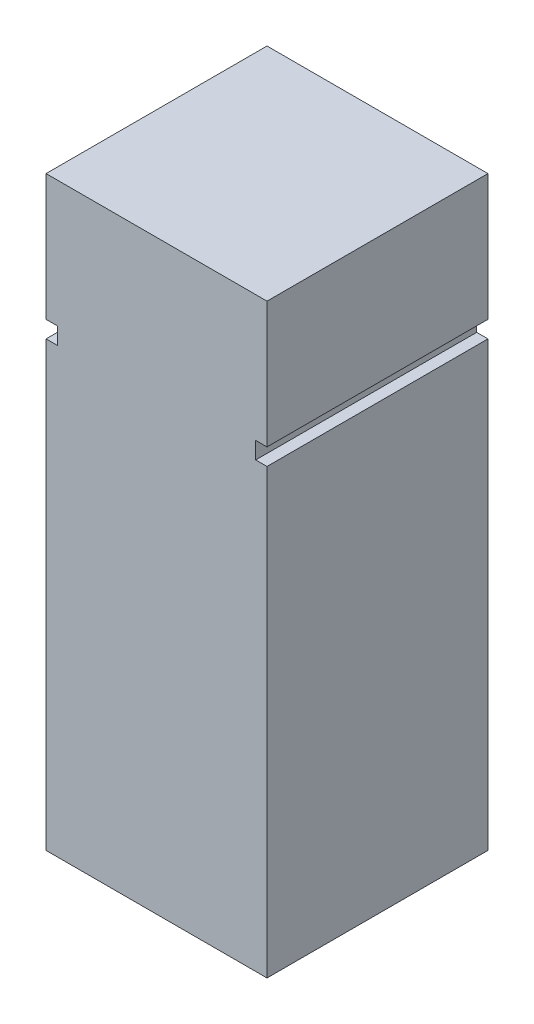
ISO-10303-21;
HEADER;
FILE_DESCRIPTION(('STEP AP214'),'2;1');
FILE_NAME('part.step','',(''),(''),'','','');
FILE_SCHEMA(('AUTOMOTIVE_DESIGN { 1 0 10303 214 1 1 1 1 }'));
ENDSEC;
DATA;
#1=APPLICATION_CONTEXT('core data for automotive mechanical design processes');
#2=APPLICATION_PROTOCOL_DEFINITION('international standard','automotive_design',2000,#1);
#3=PRODUCT_CONTEXT('',#1,'mechanical');
#4=PRODUCT('Part','Part','',(#3));
#5=PRODUCT_RELATED_PRODUCT_CATEGORY('part','',(#4));
#6=PRODUCT_DEFINITION_FORMATION('','',#4);
#7=PRODUCT_DEFINITION_CONTEXT('part definition',#1,'design');
#8=PRODUCT_DEFINITION('design','',#6,#7);
#9=PRODUCT_DEFINITION_SHAPE('','',#8);
#10=(LENGTH_UNIT() NAMED_UNIT(*) SI_UNIT(.MILLI.,.METRE.));
#11=(NAMED_UNIT(*) PLANE_ANGLE_UNIT() SI_UNIT($,.RADIAN.));
#12=(NAMED_UNIT(*) SI_UNIT($,.STERADIAN.) SOLID_ANGLE_UNIT());
#13=UNCERTAINTY_MEASURE_WITH_UNIT(LENGTH_MEASURE(1.E-05),#10,'distance_accuracy_value','');
#14=(GEOMETRIC_REPRESENTATION_CONTEXT(3) GLOBAL_UNCERTAINTY_ASSIGNED_CONTEXT((#13)) GLOBAL_UNIT_ASSIGNED_CONTEXT((#10,
#11,#12)) REPRESENTATION_CONTEXT('',''));
#15=CARTESIAN_POINT('',(0.,0.,0.));
#16=DIRECTION('',(0.,0.,1.));
#17=DIRECTION('',(1.,0.,0.));
#18=AXIS2_PLACEMENT_3D('',#15,#16,#17);
#19=CARTESIAN_POINT('',(-31.7521779296842,22.947758524,24.892));
#20=DIRECTION('',(1.,0.,0.));
#21=DIRECTION('',(0.,1.,0.));
#22=AXIS2_PLACEMENT_3D('',#19,#20,#21);
#23=PLANE('',#22);
#24=DIRECTION('',(0.,0.,1.));
#25=VECTOR('',#24,1.);
#26=CARTESIAN_POINT('',(-31.7521779296842,8.72375852400002,-2.28952505991963));
#27=LINE('',#26,#25);
#28=CARTESIAN_POINT('',(-31.7521779296842,8.72375852400002,0.));
#29=VERTEX_POINT('',#28);
#30=CARTESIAN_POINT('',(-31.7521779296842,8.72375852400002,24.892));
#31=VERTEX_POINT('',#30);
#32=EDGE_CURVE('E147',#29,#31,#27,.T.);
#33=ORIENTED_EDGE('',*,*,#32,.T.);
#34=DIRECTION('',(0.,-1.,0.));
#35=VECTOR('',#34,1.);
#36=CARTESIAN_POINT('',(-31.7521779296842,22.947758524,24.892));
#37=LINE('',#36,#35);
#38=CARTESIAN_POINT('',(-31.7521779296842,22.947758524,24.892));
#39=VERTEX_POINT('',#38);
#40=EDGE_CURVE('E164',#39,#31,#37,.T.);
#41=ORIENTED_EDGE('',*,*,#40,.F.);
#42=DIRECTION('',(0.,0.,-1.));
#43=VECTOR('',#42,1.);
#44=CARTESIAN_POINT('',(-31.7521779296842,22.947758524,24.892));
#45=LINE('',#44,#43);
#46=CARTESIAN_POINT('',(-31.7521779296842,22.947758524,0.));
#47=VERTEX_POINT('',#46);
#48=EDGE_CURVE('E226',#39,#47,#45,.T.);
#49=ORIENTED_EDGE('',*,*,#48,.T.);
#50=DIRECTION('',(0.,-1.,0.));
#51=VECTOR('',#50,1.);
#52=CARTESIAN_POINT('',(-31.7521779296842,22.947758524,0.));
#53=LINE('',#52,#51);
#54=EDGE_CURVE('E227',#47,#29,#53,.T.);
#55=ORIENTED_EDGE('',*,*,#54,.T.);
#56=EDGE_LOOP('',(#33,#41,#49,#55));
#57=FACE_BOUND('',#56,.T.);
#58=ADVANCED_FACE('F43',(#57),#23,.F.);
#59=CARTESIAN_POINT('',(-6.86017792968422,22.947758524,24.892));
#60=DIRECTION('',(-1.,0.,0.));
#61=DIRECTION('',(0.,-1.,0.));
#62=AXIS2_PLACEMENT_3D('',#59,#60,#61);
#63=PLANE('',#62);
#64=DIRECTION('',(0.,0.,1.));
#65=VECTOR('',#64,1.);
#66=CARTESIAN_POINT('',(-6.86017792968422,8.72375852400002,-2.28952505991963));
#67=LINE('',#66,#65);
#68=CARTESIAN_POINT('',(-6.86017792968422,8.72375852400002,0.));
#69=VERTEX_POINT('',#68);
#70=CARTESIAN_POINT('',(-6.86017792968422,8.72375852400002,24.892));
#71=VERTEX_POINT('',#70);
#72=EDGE_CURVE('E185',#69,#71,#67,.T.);
#73=ORIENTED_EDGE('',*,*,#72,.F.);
#74=DIRECTION('',(0.,1.,0.));
#75=VECTOR('',#74,1.);
#76=CARTESIAN_POINT('',(-6.86017792968422,22.947758524,0.));
#77=LINE('',#76,#75);
#78=CARTESIAN_POINT('',(-6.86017792968422,22.947758524,0.));
#79=VERTEX_POINT('',#78);
#80=EDGE_CURVE('E235',#69,#79,#77,.T.);
#81=ORIENTED_EDGE('',*,*,#80,.T.);
#82=DIRECTION('',(0.,0.,-1.));
#83=VECTOR('',#82,1.);
#84=CARTESIAN_POINT('',(-6.86017792968422,22.947758524,24.892));
#85=LINE('',#84,#83);
#86=CARTESIAN_POINT('',(-6.86017792968422,22.947758524,24.892));
#87=VERTEX_POINT('',#86);
#88=EDGE_CURVE('E246',#87,#79,#85,.T.);
#89=ORIENTED_EDGE('',*,*,#88,.F.);
#90=DIRECTION('',(0.,1.,0.));
#91=VECTOR('',#90,1.);
#92=CARTESIAN_POINT('',(-6.86017792968422,22.947758524,24.892));
#93=LINE('',#92,#91);
#94=EDGE_CURVE('E218',#71,#87,#93,.T.);
#95=ORIENTED_EDGE('',*,*,#94,.F.);
#96=EDGE_LOOP('',(#73,#81,#89,#95));
#97=FACE_BOUND('',#96,.T.);
#98=ADVANCED_FACE('F291',(#97),#63,.F.);
#99=CARTESIAN_POINT('',(0.,0.,24.892));
#100=DIRECTION('',(0.,0.,1.));
#101=DIRECTION('',(1.,0.,0.));
#102=AXIS2_PLACEMENT_3D('',#99,#100,#101);
#103=PLANE('',#102);
#104=ORIENTED_EDGE('',*,*,#40,.T.);
#105=DIRECTION('',(1.,0.,0.));
#106=VECTOR('',#105,1.);
#107=CARTESIAN_POINT('',(0.,8.72375852400002,24.892));
#108=LINE('',#107,#106);
#109=CARTESIAN_POINT('',(-30.4821779296842,8.72375852400002,24.892));
#110=VERTEX_POINT('',#109);
#111=EDGE_CURVE('E141',#31,#110,#108,.T.);
#112=ORIENTED_EDGE('',*,*,#111,.T.);
#113=DIRECTION('',(0.,-1.,0.));
#114=VECTOR('',#113,1.);
#115=CARTESIAN_POINT('',(-30.4821779296842,0.,24.892));
#116=LINE('',#115,#114);
#117=CARTESIAN_POINT('',(-30.4821779296842,6.81875852400002,24.892));
#118=VERTEX_POINT('',#117);
#119=EDGE_CURVE('E151',#110,#118,#116,.T.);
#120=ORIENTED_EDGE('',*,*,#119,.T.);
#121=DIRECTION('',(1.,0.,0.));
#122=VECTOR('',#121,1.);
#123=CARTESIAN_POINT('',(0.,6.81875852400002,24.892));
#124=LINE('',#123,#122);
#125=CARTESIAN_POINT('',(-31.7521779296842,6.81875852400002,24.892));
#126=VERTEX_POINT('',#125);
#127=EDGE_CURVE('E148',#126,#118,#124,.T.);
#128=ORIENTED_EDGE('',*,*,#127,.F.);
#129=CARTESIAN_POINT('',(-31.7521779296842,-43.092241476,24.892));
#130=VERTEX_POINT('',#129);
#131=EDGE_CURVE('E215',#126,#130,#37,.T.);
#132=ORIENTED_EDGE('',*,*,#131,.T.);
#133=DIRECTION('',(1.,0.,0.));
#134=VECTOR('',#133,1.);
#135=CARTESIAN_POINT('',(-31.7521779296842,-43.092241476,24.892));
#136=LINE('',#135,#134);
#137=CARTESIAN_POINT('',(-6.86017792968421,-43.092241476,24.892));
#138=VERTEX_POINT('',#137);
#139=EDGE_CURVE('E214',#130,#138,#136,.T.);
#140=ORIENTED_EDGE('',*,*,#139,.T.);
#141=CARTESIAN_POINT('',(-6.86017792968422,6.81875852400002,24.892));
#142=VERTEX_POINT('',#141);
#143=EDGE_CURVE('E219',#138,#142,#93,.T.);
#144=ORIENTED_EDGE('',*,*,#143,.T.);
#145=DIRECTION('',(1.,0.,0.));
#146=VECTOR('',#145,1.);
#147=CARTESIAN_POINT('',(0.,6.81875852400002,24.892));
#148=LINE('',#147,#146);
#149=CARTESIAN_POINT('',(-8.13017792968422,6.81875852400002,24.892));
#150=VERTEX_POINT('',#149);
#151=EDGE_CURVE('E196',#150,#142,#148,.T.);
#152=ORIENTED_EDGE('',*,*,#151,.F.);
#153=DIRECTION('',(0.,-1.,0.));
#154=VECTOR('',#153,1.);
#155=CARTESIAN_POINT('',(-8.13017792968421,0.,24.892));
#156=LINE('',#155,#154);
#157=CARTESIAN_POINT('',(-8.13017792968422,8.72375852400002,24.892));
#158=VERTEX_POINT('',#157);
#159=EDGE_CURVE('E193',#158,#150,#156,.T.);
#160=ORIENTED_EDGE('',*,*,#159,.F.);
#161=DIRECTION('',(1.,0.,0.));
#162=VECTOR('',#161,1.);
#163=CARTESIAN_POINT('',(0.,8.72375852400002,24.892));
#164=LINE('',#163,#162);
#165=EDGE_CURVE('E189',#158,#71,#164,.T.);
#166=ORIENTED_EDGE('',*,*,#165,.T.);
#167=ORIENTED_EDGE('',*,*,#94,.T.);
#168=DIRECTION('',(-1.,0.,0.));
#169=VECTOR('',#168,1.);
#170=CARTESIAN_POINT('',(-31.7521779296842,22.947758524,24.892));
#171=LINE('',#170,#169);
#172=EDGE_CURVE('E223',#87,#39,#171,.T.);
#173=ORIENTED_EDGE('',*,*,#172,.T.);
#174=EDGE_LOOP('',(#104,#112,#120,#128,#132,#140,#144,#152,#160,#166,#167,#173));
#175=FACE_BOUND('',#174,.T.);
#176=ADVANCED_FACE('F162',(#175),#103,.T.);
#177=CARTESIAN_POINT('',(0.,0.,0.));
#178=DIRECTION('',(0.,0.,1.));
#179=DIRECTION('',(1.,0.,0.));
#180=AXIS2_PLACEMENT_3D('',#177,#178,#179);
#181=PLANE('',#180);
#182=DIRECTION('',(-1.,0.,0.));
#183=VECTOR('',#182,1.);
#184=CARTESIAN_POINT('',(0.,8.72375852400002,0.));
#185=LINE('',#184,#183);
#186=CARTESIAN_POINT('',(-30.4821779296842,8.72375852400002,0.));
#187=VERTEX_POINT('',#186);
#188=EDGE_CURVE('E144',#187,#29,#185,.T.);
#189=ORIENTED_EDGE('',*,*,#188,.T.);
#190=ORIENTED_EDGE('',*,*,#54,.F.);
#191=DIRECTION('',(-1.,0.,0.));
#192=VECTOR('',#191,1.);
#193=CARTESIAN_POINT('',(-31.7521779296842,22.947758524,0.));
#194=LINE('',#193,#192);
#195=EDGE_CURVE('E240',#79,#47,#194,.T.);
#196=ORIENTED_EDGE('',*,*,#195,.F.);
#197=ORIENTED_EDGE('',*,*,#80,.F.);
#198=DIRECTION('',(-1.,0.,0.));
#199=VECTOR('',#198,1.);
#200=CARTESIAN_POINT('',(0.,8.72375852400002,0.));
#201=LINE('',#200,#199);
#202=CARTESIAN_POINT('',(-8.13017792968422,8.72375852400002,0.));
#203=VERTEX_POINT('',#202);
#204=EDGE_CURVE('E184',#69,#203,#201,.T.);
#205=ORIENTED_EDGE('',*,*,#204,.T.);
#206=DIRECTION('',(0.,1.,0.));
#207=VECTOR('',#206,1.);
#208=CARTESIAN_POINT('',(-8.13017792968421,0.,0.));
#209=LINE('',#208,#207);
#210=CARTESIAN_POINT('',(-8.13017792968422,6.81875852400002,0.));
#211=VERTEX_POINT('',#210);
#212=EDGE_CURVE('E159',#211,#203,#209,.T.);
#213=ORIENTED_EDGE('',*,*,#212,.F.);
#214=DIRECTION('',(-1.,0.,0.));
#215=VECTOR('',#214,1.);
#216=CARTESIAN_POINT('',(0.,6.81875852400002,0.));
#217=LINE('',#216,#215);
#218=CARTESIAN_POINT('',(-6.86017792968422,6.81875852400002,0.));
#219=VERTEX_POINT('',#218);
#220=EDGE_CURVE('E181',#219,#211,#217,.T.);
#221=ORIENTED_EDGE('',*,*,#220,.F.);
#222=CARTESIAN_POINT('',(-6.86017792968421,-43.092241476,0.));
#223=VERTEX_POINT('',#222);
#224=EDGE_CURVE('E236',#223,#219,#77,.T.);
#225=ORIENTED_EDGE('',*,*,#224,.F.);
#226=DIRECTION('',(1.,0.,0.));
#227=VECTOR('',#226,1.);
#228=CARTESIAN_POINT('',(-31.7521779296842,-43.092241476,0.));
#229=LINE('',#228,#227);
#230=CARTESIAN_POINT('',(-31.7521779296842,-43.092241476,0.));
#231=VERTEX_POINT('',#230);
#232=EDGE_CURVE('E231',#231,#223,#229,.T.);
#233=ORIENTED_EDGE('',*,*,#232,.F.);
#234=CARTESIAN_POINT('',(-31.7521779296842,6.81875852400002,0.));
#235=VERTEX_POINT('',#234);
#236=EDGE_CURVE('E232',#235,#231,#53,.T.);
#237=ORIENTED_EDGE('',*,*,#236,.F.);
#238=DIRECTION('',(-1.,0.,0.));
#239=VECTOR('',#238,1.);
#240=CARTESIAN_POINT('',(0.,6.81875852400002,0.));
#241=LINE('',#240,#239);
#242=CARTESIAN_POINT('',(-30.4821779296842,6.81875852400002,0.));
#243=VERTEX_POINT('',#242);
#244=EDGE_CURVE('E180',#243,#235,#241,.T.);
#245=ORIENTED_EDGE('',*,*,#244,.F.);
#246=DIRECTION('',(0.,1.,0.));
#247=VECTOR('',#246,1.);
#248=CARTESIAN_POINT('',(-30.4821779296842,0.,0.));
#249=LINE('',#248,#247);
#250=EDGE_CURVE('E275',#243,#187,#249,.T.);
#251=ORIENTED_EDGE('',*,*,#250,.T.);
#252=EDGE_LOOP('',(#189,#190,#196,#197,#205,#213,#221,#225,#233,#237,#245,#251));
#253=FACE_BOUND('',#252,.T.);
#254=ADVANCED_FACE('F261',(#253),#181,.F.);
#255=ORIENTED_EDGE('',*,*,#131,.F.);
#256=DIRECTION('',(0.,0.,1.));
#257=VECTOR('',#256,1.);
#258=CARTESIAN_POINT('',(-31.7521779296842,6.81875852400002,-2.28952505991963));
#259=LINE('',#258,#257);
#260=EDGE_CURVE('E173',#235,#126,#259,.T.);
#261=ORIENTED_EDGE('',*,*,#260,.F.);
#262=ORIENTED_EDGE('',*,*,#236,.T.);
#263=DIRECTION('',(0.,0.,-1.));
#264=VECTOR('',#263,1.);
#265=CARTESIAN_POINT('',(-31.7521779296842,-43.092241476,24.892));
#266=LINE('',#265,#264);
#267=EDGE_CURVE('E11',#130,#231,#266,.T.);
#268=ORIENTED_EDGE('',*,*,#267,.F.);
#269=EDGE_LOOP('',(#255,#261,#262,#268));
#270=FACE_BOUND('',#269,.T.);
#271=ADVANCED_FACE('F45',(#270),#23,.F.);
#272=CARTESIAN_POINT('',(-31.7521779296842,-43.092241476,24.892));
#273=DIRECTION('',(0.,1.,0.));
#274=DIRECTION('',(0.,0.,1.));
#275=AXIS2_PLACEMENT_3D('',#272,#273,#274);
#276=PLANE('',#275);
#277=ORIENTED_EDGE('',*,*,#232,.T.);
#278=DIRECTION('',(0.,0.,-1.));
#279=VECTOR('',#278,1.);
#280=CARTESIAN_POINT('',(-6.86017792968421,-43.092241476,24.892));
#281=LINE('',#280,#279);
#282=EDGE_CURVE('E52',#138,#223,#281,.T.);
#283=ORIENTED_EDGE('',*,*,#282,.F.);
#284=ORIENTED_EDGE('',*,*,#139,.F.);
#285=ORIENTED_EDGE('',*,*,#267,.T.);
#286=EDGE_LOOP('',(#277,#283,#284,#285));
#287=FACE_BOUND('',#286,.T.);
#288=ADVANCED_FACE('F270',(#287),#276,.F.);
#289=ORIENTED_EDGE('',*,*,#224,.T.);
#290=DIRECTION('',(0.,0.,1.));
#291=VECTOR('',#290,1.);
#292=CARTESIAN_POINT('',(-6.86017792968422,6.81875852400002,-2.28952505991963));
#293=LINE('',#292,#291);
#294=EDGE_CURVE('E202',#219,#142,#293,.T.);
#295=ORIENTED_EDGE('',*,*,#294,.T.);
#296=ORIENTED_EDGE('',*,*,#143,.F.);
#297=ORIENTED_EDGE('',*,*,#282,.T.);
#298=EDGE_LOOP('',(#289,#295,#296,#297));
#299=FACE_BOUND('',#298,.T.);
#300=ADVANCED_FACE('F255',(#299),#63,.F.);
#301=CARTESIAN_POINT('',(-31.7521779296842,22.947758524,24.892));
#302=DIRECTION('',(0.,-1.,0.));
#303=DIRECTION('',(0.,0.,-1.));
#304=AXIS2_PLACEMENT_3D('',#301,#302,#303);
#305=PLANE('',#304);
#306=ORIENTED_EDGE('',*,*,#195,.T.);
#307=ORIENTED_EDGE('',*,*,#48,.F.);
#308=ORIENTED_EDGE('',*,*,#172,.F.);
#309=ORIENTED_EDGE('',*,*,#88,.T.);
#310=EDGE_LOOP('',(#306,#307,#308,#309));
#311=FACE_BOUND('',#310,.T.);
#312=ADVANCED_FACE('F310',(#311),#305,.F.);
#313=CARTESIAN_POINT('',(0.,8.72375852400002,-2.28952505991963));
#314=DIRECTION('',(0.,-1.,0.));
#315=DIRECTION('',(0.,0.,-1.));
#316=AXIS2_PLACEMENT_3D('',#313,#314,#315);
#317=PLANE('',#316);
#318=ORIENTED_EDGE('',*,*,#72,.T.);
#319=ORIENTED_EDGE('',*,*,#165,.F.);
#320=DIRECTION('',(0.,0.,1.));
#321=VECTOR('',#320,1.);
#322=CARTESIAN_POINT('',(-8.13017792968422,8.72375852400002,-2.28952505991963));
#323=LINE('',#322,#321);
#324=EDGE_CURVE('E199',#203,#158,#323,.T.);
#325=ORIENTED_EDGE('',*,*,#324,.F.);
#326=ORIENTED_EDGE('',*,*,#204,.F.);
#327=EDGE_LOOP('',(#318,#319,#325,#326));
#328=FACE_BOUND('',#327,.T.);
#329=ADVANCED_FACE('F312',(#328),#317,.T.);
#330=CARTESIAN_POINT('',(0.,6.81875852400002,-2.28952505991963));
#331=DIRECTION('',(0.,-1.,0.));
#332=DIRECTION('',(1.,0.,0.));
#333=AXIS2_PLACEMENT_3D('',#330,#331,#332);
#334=PLANE('',#333);
#335=ORIENTED_EDGE('',*,*,#220,.T.);
#336=DIRECTION('',(0.,0.,1.));
#337=VECTOR('',#336,1.);
#338=CARTESIAN_POINT('',(-8.13017792968422,6.81875852400002,-2.28952505991963));
#339=LINE('',#338,#337);
#340=EDGE_CURVE('E70',#211,#150,#339,.T.);
#341=ORIENTED_EDGE('',*,*,#340,.T.);
#342=ORIENTED_EDGE('',*,*,#151,.T.);
#343=ORIENTED_EDGE('',*,*,#294,.F.);
#344=EDGE_LOOP('',(#335,#341,#342,#343));
#345=FACE_BOUND('',#344,.T.);
#346=ADVANCED_FACE('F265',(#345),#334,.F.);
#347=CARTESIAN_POINT('',(-8.13017792968421,0.,-2.28952505991963));
#348=DIRECTION('',(-1.,0.,0.));
#349=DIRECTION('',(0.,-1.,0.));
#350=AXIS2_PLACEMENT_3D('',#347,#348,#349);
#351=PLANE('',#350);
#352=ORIENTED_EDGE('',*,*,#212,.T.);
#353=ORIENTED_EDGE('',*,*,#324,.T.);
#354=ORIENTED_EDGE('',*,*,#159,.T.);
#355=ORIENTED_EDGE('',*,*,#340,.F.);
#356=EDGE_LOOP('',(#352,#353,#354,#355));
#357=FACE_BOUND('',#356,.T.);
#358=ADVANCED_FACE('F288',(#357),#351,.F.);
#359=CARTESIAN_POINT('',(0.,8.72375852400002,-2.28952505991963));
#360=DIRECTION('',(0.,-1.,0.));
#361=DIRECTION('',(0.,0.,-1.));
#362=AXIS2_PLACEMENT_3D('',#359,#360,#361);
#363=PLANE('',#362);
#364=DIRECTION('',(0.,0.,1.));
#365=VECTOR('',#364,1.);
#366=CARTESIAN_POINT('',(-30.4821779296842,8.72375852400002,-2.28952505991963));
#367=LINE('',#366,#365);
#368=EDGE_CURVE('E59',#187,#110,#367,.T.);
#369=ORIENTED_EDGE('',*,*,#368,.T.);
#370=ORIENTED_EDGE('',*,*,#111,.F.);
#371=ORIENTED_EDGE('',*,*,#32,.F.);
#372=ORIENTED_EDGE('',*,*,#188,.F.);
#373=EDGE_LOOP('',(#369,#370,#371,#372));
#374=FACE_BOUND('',#373,.T.);
#375=ADVANCED_FACE('F139',(#374),#363,.T.);
#376=CARTESIAN_POINT('',(0.,6.81875852400002,-2.28952505991963));
#377=DIRECTION('',(0.,-1.,0.));
#378=DIRECTION('',(1.,0.,0.));
#379=AXIS2_PLACEMENT_3D('',#376,#377,#378);
#380=PLANE('',#379);
#381=ORIENTED_EDGE('',*,*,#244,.T.);
#382=ORIENTED_EDGE('',*,*,#260,.T.);
#383=ORIENTED_EDGE('',*,*,#127,.T.);
#384=DIRECTION('',(0.,0.,1.));
#385=VECTOR('',#384,1.);
#386=CARTESIAN_POINT('',(-30.4821779296842,6.81875852400002,-2.28952505991963));
#387=LINE('',#386,#385);
#388=EDGE_CURVE('E154',#243,#118,#387,.T.);
#389=ORIENTED_EDGE('',*,*,#388,.F.);
#390=EDGE_LOOP('',(#381,#382,#383,#389));
#391=FACE_BOUND('',#390,.T.);
#392=ADVANCED_FACE('F280',(#391),#380,.F.);
#393=CARTESIAN_POINT('',(-30.4821779296842,0.,-2.28952505991963));
#394=DIRECTION('',(-1.,0.,0.));
#395=DIRECTION('',(0.,0.,1.));
#396=AXIS2_PLACEMENT_3D('',#393,#394,#395);
#397=PLANE('',#396);
#398=ORIENTED_EDGE('',*,*,#388,.T.);
#399=ORIENTED_EDGE('',*,*,#119,.F.);
#400=ORIENTED_EDGE('',*,*,#368,.F.);
#401=ORIENTED_EDGE('',*,*,#250,.F.);
#402=EDGE_LOOP('',(#398,#399,#400,#401));
#403=FACE_BOUND('',#402,.T.);
#404=ADVANCED_FACE('F152',(#403),#397,.T.);
#405=CLOSED_SHELL('',(#58,#98,#176,#254,#271,#288,#300,#312,#329,#346,#358,#375,#392,#404));
#406=MANIFOLD_SOLID_BREP('B2',#405);
#407=ADVANCED_BREP_SHAPE_REPRESENTATION('',(#18,#406),#14);
#408=SHAPE_DEFINITION_REPRESENTATION(#9,#407);
ENDSEC;
END-ISO-10303-21;
